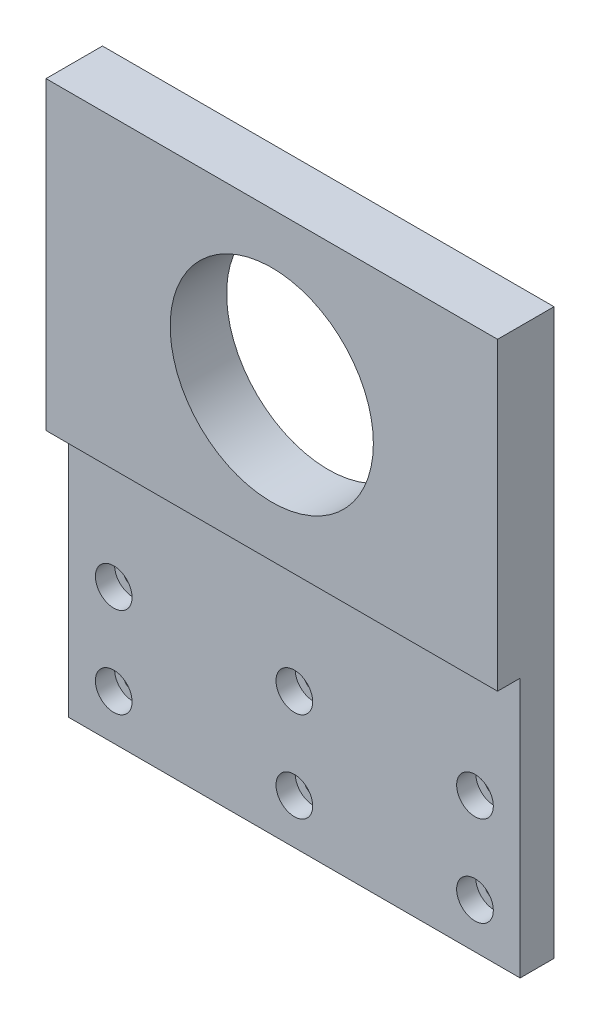
ISO-10303-21;
HEADER;
FILE_DESCRIPTION(('STEP AP214'),'2;1');
FILE_NAME('part.step','',(''),(''),'','','');
FILE_SCHEMA(('AUTOMOTIVE_DESIGN { 1 0 10303 214 1 1 1 1 }'));
ENDSEC;
DATA;
#1=APPLICATION_CONTEXT('core data for automotive mechanical design processes');
#2=APPLICATION_PROTOCOL_DEFINITION('international standard','automotive_design',2000,#1);
#3=PRODUCT_CONTEXT('',#1,'mechanical');
#4=PRODUCT('Part','Part','',(#3));
#5=PRODUCT_RELATED_PRODUCT_CATEGORY('part','',(#4));
#6=PRODUCT_DEFINITION_FORMATION('','',#4);
#7=PRODUCT_DEFINITION_CONTEXT('part definition',#1,'design');
#8=PRODUCT_DEFINITION('design','',#6,#7);
#9=PRODUCT_DEFINITION_SHAPE('','',#8);
#10=(LENGTH_UNIT() NAMED_UNIT(*) SI_UNIT(.MILLI.,.METRE.));
#11=(NAMED_UNIT(*) PLANE_ANGLE_UNIT() SI_UNIT($,.RADIAN.));
#12=(NAMED_UNIT(*) SI_UNIT($,.STERADIAN.) SOLID_ANGLE_UNIT());
#13=UNCERTAINTY_MEASURE_WITH_UNIT(LENGTH_MEASURE(1.E-05),#10,'distance_accuracy_value','');
#14=(GEOMETRIC_REPRESENTATION_CONTEXT(3) GLOBAL_UNCERTAINTY_ASSIGNED_CONTEXT((#13)) GLOBAL_UNIT_ASSIGNED_CONTEXT((#10,
#11,#12)) REPRESENTATION_CONTEXT('',''));
#15=CARTESIAN_POINT('',(0.,0.,0.));
#16=DIRECTION('',(0.,0.,1.));
#17=DIRECTION('',(1.,0.,0.));
#18=AXIS2_PLACEMENT_3D('',#15,#16,#17);
#19=CARTESIAN_POINT('',(0.,0.,10.));
#20=DIRECTION('',(1.,0.,0.));
#21=DIRECTION('',(0.,0.,-1.));
#22=AXIS2_PLACEMENT_3D('',#19,#20,#21);
#23=PLANE('',#22);
#24=DIRECTION('',(0.,-1.,0.));
#25=VECTOR('',#24,1.);
#26=CARTESIAN_POINT('',(0.,0.,6.));
#27=LINE('',#26,#25);
#28=CARTESIAN_POINT('',(0.,46.,6.));
#29=VERTEX_POINT('',#28);
#30=CARTESIAN_POINT('',(0.,0.,6.));
#31=VERTEX_POINT('',#30);
#32=EDGE_CURVE('E144',#29,#31,#27,.T.);
#33=ORIENTED_EDGE('',*,*,#32,.F.);
#34=DIRECTION('',(0.,0.,1.));
#35=VECTOR('',#34,1.);
#36=CARTESIAN_POINT('',(0.,46.,6.));
#37=LINE('',#36,#35);
#38=CARTESIAN_POINT('',(0.,46.,10.));
#39=VERTEX_POINT('',#38);
#40=EDGE_CURVE('E154',#29,#39,#37,.T.);
#41=ORIENTED_EDGE('',*,*,#40,.T.);
#42=DIRECTION('',(0.,-1.,0.));
#43=VECTOR('',#42,1.);
#44=CARTESIAN_POINT('',(0.,0.,10.));
#45=LINE('',#44,#43);
#46=CARTESIAN_POINT('',(0.,100.,10.));
#47=VERTEX_POINT('',#46);
#48=EDGE_CURVE('E98',#47,#39,#45,.T.);
#49=ORIENTED_EDGE('',*,*,#48,.F.);
#50=DIRECTION('',(0.,0.,-1.));
#51=VECTOR('',#50,1.);
#52=CARTESIAN_POINT('',(0.,100.,10.));
#53=LINE('',#52,#51);
#54=CARTESIAN_POINT('',(0.,100.,0.));
#55=VERTEX_POINT('',#54);
#56=EDGE_CURVE('E90',#47,#55,#53,.T.);
#57=ORIENTED_EDGE('',*,*,#56,.T.);
#58=DIRECTION('',(0.,-1.,0.));
#59=VECTOR('',#58,1.);
#60=CARTESIAN_POINT('',(0.,0.,0.));
#61=LINE('',#60,#59);
#62=CARTESIAN_POINT('',(0.,0.,0.));
#63=VERTEX_POINT('',#62);
#64=EDGE_CURVE('E105',#55,#63,#61,.T.);
#65=ORIENTED_EDGE('',*,*,#64,.T.);
#66=DIRECTION('',(0.,0.,-1.));
#67=VECTOR('',#66,1.);
#68=CARTESIAN_POINT('',(0.,0.,10.));
#69=LINE('',#68,#67);
#70=EDGE_CURVE('E11',#31,#63,#69,.T.);
#71=ORIENTED_EDGE('',*,*,#70,.F.);
#72=EDGE_LOOP('',(#33,#41,#49,#57,#65,#71));
#73=FACE_BOUND('',#72,.T.);
#74=ADVANCED_FACE('F45',(#73),#23,.F.);
#75=CARTESIAN_POINT('',(0.,0.,10.));
#76=DIRECTION('',(0.,1.,0.));
#77=DIRECTION('',(0.,0.,1.));
#78=AXIS2_PLACEMENT_3D('',#75,#76,#77);
#79=PLANE('',#78);
#80=DIRECTION('',(0.,0.,-1.));
#81=VECTOR('',#80,1.);
#82=CARTESIAN_POINT('',(80.,0.,10.));
#83=LINE('',#82,#81);
#84=CARTESIAN_POINT('',(80.,0.,6.));
#85=VERTEX_POINT('',#84);
#86=CARTESIAN_POINT('',(80.,0.,0.));
#87=VERTEX_POINT('',#86);
#88=EDGE_CURVE('E53',#85,#87,#83,.T.);
#89=ORIENTED_EDGE('',*,*,#88,.F.);
#90=DIRECTION('',(1.,0.,0.));
#91=VECTOR('',#90,1.);
#92=CARTESIAN_POINT('',(0.,0.,6.));
#93=LINE('',#92,#91);
#94=EDGE_CURVE('E142',#31,#85,#93,.T.);
#95=ORIENTED_EDGE('',*,*,#94,.F.);
#96=ORIENTED_EDGE('',*,*,#70,.T.);
#97=DIRECTION('',(1.,0.,0.));
#98=VECTOR('',#97,1.);
#99=CARTESIAN_POINT('',(0.,0.,0.));
#100=LINE('',#99,#98);
#101=EDGE_CURVE('E112',#63,#87,#100,.T.);
#102=ORIENTED_EDGE('',*,*,#101,.T.);
#103=EDGE_LOOP('',(#89,#95,#96,#102));
#104=FACE_BOUND('',#103,.T.);
#105=ADVANCED_FACE('F139',(#104),#79,.F.);
#106=CARTESIAN_POINT('',(80.,0.,10.));
#107=DIRECTION('',(-1.,0.,0.));
#108=DIRECTION('',(0.,0.,1.));
#109=AXIS2_PLACEMENT_3D('',#106,#107,#108);
#110=PLANE('',#109);
#111=DIRECTION('',(0.,1.,0.));
#112=VECTOR('',#111,1.);
#113=CARTESIAN_POINT('',(80.,0.,10.));
#114=LINE('',#113,#112);
#115=CARTESIAN_POINT('',(80.,46.,10.));
#116=VERTEX_POINT('',#115);
#117=CARTESIAN_POINT('',(80.,100.,10.));
#118=VERTEX_POINT('',#117);
#119=EDGE_CURVE('E176',#116,#118,#114,.T.);
#120=ORIENTED_EDGE('',*,*,#119,.F.);
#121=DIRECTION('',(0.,0.,1.));
#122=VECTOR('',#121,1.);
#123=CARTESIAN_POINT('',(80.,46.,6.));
#124=LINE('',#123,#122);
#125=CARTESIAN_POINT('',(80.,46.,6.));
#126=VERTEX_POINT('',#125);
#127=EDGE_CURVE('E60',#126,#116,#124,.T.);
#128=ORIENTED_EDGE('',*,*,#127,.F.);
#129=DIRECTION('',(0.,1.,0.));
#130=VECTOR('',#129,1.);
#131=CARTESIAN_POINT('',(80.,0.,6.));
#132=LINE('',#131,#130);
#133=EDGE_CURVE('E136',#85,#126,#132,.T.);
#134=ORIENTED_EDGE('',*,*,#133,.F.);
#135=ORIENTED_EDGE('',*,*,#88,.T.);
#136=DIRECTION('',(0.,1.,0.));
#137=VECTOR('',#136,1.);
#138=CARTESIAN_POINT('',(80.,0.,0.));
#139=LINE('',#138,#137);
#140=CARTESIAN_POINT('',(80.,100.,0.));
#141=VERTEX_POINT('',#140);
#142=EDGE_CURVE('E99',#87,#141,#139,.T.);
#143=ORIENTED_EDGE('',*,*,#142,.T.);
#144=DIRECTION('',(0.,0.,-1.));
#145=VECTOR('',#144,1.);
#146=CARTESIAN_POINT('',(80.,100.,10.));
#147=LINE('',#146,#145);
#148=EDGE_CURVE('E93',#118,#141,#147,.T.);
#149=ORIENTED_EDGE('',*,*,#148,.F.);
#150=EDGE_LOOP('',(#120,#128,#134,#135,#143,#149));
#151=FACE_BOUND('',#150,.T.);
#152=ADVANCED_FACE('F133',(#151),#110,.F.);
#153=CARTESIAN_POINT('',(0.,100.,10.));
#154=DIRECTION('',(0.,-1.,0.));
#155=DIRECTION('',(0.,0.,-1.));
#156=AXIS2_PLACEMENT_3D('',#153,#154,#155);
#157=PLANE('',#156);
#158=DIRECTION('',(-1.,0.,0.));
#159=VECTOR('',#158,1.);
#160=CARTESIAN_POINT('',(0.,100.,0.));
#161=LINE('',#160,#159);
#162=EDGE_CURVE('E87',#141,#55,#161,.T.);
#163=ORIENTED_EDGE('',*,*,#162,.T.);
#164=ORIENTED_EDGE('',*,*,#56,.F.);
#165=DIRECTION('',(-1.,0.,0.));
#166=VECTOR('',#165,1.);
#167=CARTESIAN_POINT('',(0.,100.,10.));
#168=LINE('',#167,#166);
#169=EDGE_CURVE('E69',#118,#47,#168,.T.);
#170=ORIENTED_EDGE('',*,*,#169,.F.);
#171=ORIENTED_EDGE('',*,*,#148,.T.);
#172=EDGE_LOOP('',(#163,#164,#170,#171));
#173=FACE_BOUND('',#172,.T.);
#174=ADVANCED_FACE('F89',(#173),#157,.F.);
#175=CARTESIAN_POINT('',(0.,0.,10.));
#176=DIRECTION('',(0.,0.,-1.));
#177=DIRECTION('',(-1.,0.,0.));
#178=AXIS2_PLACEMENT_3D('',#175,#176,#177);
#179=PLANE('',#178);
#180=CARTESIAN_POINT('',(40.,73.,10.));
#181=DIRECTION('',(0.,0.,1.));
#182=DIRECTION('',(1.,0.,0.));
#183=AXIS2_PLACEMENT_3D('',#180,#181,#182);
#184=CIRCLE('',#183,18.);
#185=CARTESIAN_POINT('',(58.,73.,10.));
#186=VERTEX_POINT('',#185);
#187=EDGE_CURVE('E120',#186,#186,#184,.T.);
#188=ORIENTED_EDGE('',*,*,#187,.F.);
#189=EDGE_LOOP('',(#188));
#190=FACE_BOUND('',#189,.T.);
#191=ORIENTED_EDGE('',*,*,#48,.T.);
#192=DIRECTION('',(-1.,0.,0.));
#193=VECTOR('',#192,1.);
#194=CARTESIAN_POINT('',(0.,46.,10.));
#195=LINE('',#194,#193);
#196=EDGE_CURVE('E157',#116,#39,#195,.T.);
#197=ORIENTED_EDGE('',*,*,#196,.F.);
#198=ORIENTED_EDGE('',*,*,#119,.T.);
#199=ORIENTED_EDGE('',*,*,#169,.T.);
#200=EDGE_LOOP('',(#191,#197,#198,#199));
#201=FACE_BOUND('',#200,.T.);
#202=ADVANCED_FACE('F179',(#190,#201),#179,.F.);
#203=CARTESIAN_POINT('',(0.,0.,0.));
#204=DIRECTION('',(0.,0.,-1.));
#205=DIRECTION('',(-1.,0.,0.));
#206=AXIS2_PLACEMENT_3D('',#203,#204,#205);
#207=PLANE('',#206);
#208=CARTESIAN_POINT('',(8.00000000000001,8.,0.));
#209=DIRECTION('',(0.,0.,1.));
#210=DIRECTION('',(1.,0.,0.));
#211=AXIS2_PLACEMENT_3D('',#208,#209,#210);
#212=CIRCLE('',#211,1.7);
#213=CARTESIAN_POINT('',(9.70000000000001,8.,0.));
#214=VERTEX_POINT('',#213);
#215=EDGE_CURVE('E447',#214,#214,#212,.T.);
#216=ORIENTED_EDGE('',*,*,#215,.T.);
#217=EDGE_LOOP('',(#216));
#218=FACE_BOUND('',#217,.T.);
#219=CARTESIAN_POINT('',(40.,8.,0.));
#220=DIRECTION('',(0.,0.,1.));
#221=DIRECTION('',(1.,0.,0.));
#222=AXIS2_PLACEMENT_3D('',#219,#220,#221);
#223=CIRCLE('',#222,1.7);
#224=CARTESIAN_POINT('',(41.7,8.,0.));
#225=VERTEX_POINT('',#224);
#226=EDGE_CURVE('E463',#225,#225,#223,.T.);
#227=ORIENTED_EDGE('',*,*,#226,.T.);
#228=EDGE_LOOP('',(#227));
#229=FACE_BOUND('',#228,.T.);
#230=CARTESIAN_POINT('',(72.,8.,0.));
#231=DIRECTION('',(0.,0.,1.));
#232=DIRECTION('',(1.,0.,0.));
#233=AXIS2_PLACEMENT_3D('',#230,#231,#232);
#234=CIRCLE('',#233,1.69999999999999);
#235=CARTESIAN_POINT('',(73.7,8.,0.));
#236=VERTEX_POINT('',#235);
#237=EDGE_CURVE('E479',#236,#236,#234,.T.);
#238=ORIENTED_EDGE('',*,*,#237,.T.);
#239=EDGE_LOOP('',(#238));
#240=FACE_BOUND('',#239,.T.);
#241=CARTESIAN_POINT('',(39.9999999999999,24.,0.));
#242=DIRECTION('',(0.,0.,1.));
#243=DIRECTION('',(1.,0.,0.));
#244=AXIS2_PLACEMENT_3D('',#241,#242,#243);
#245=CIRCLE('',#244,1.7);
#246=CARTESIAN_POINT('',(41.6999999999999,24.,0.));
#247=VERTEX_POINT('',#246);
#248=EDGE_CURVE('E495',#247,#247,#245,.T.);
#249=ORIENTED_EDGE('',*,*,#248,.T.);
#250=EDGE_LOOP('',(#249));
#251=FACE_BOUND('',#250,.T.);
#252=CARTESIAN_POINT('',(71.9999999999999,24.,0.));
#253=DIRECTION('',(0.,0.,1.));
#254=DIRECTION('',(1.,0.,0.));
#255=AXIS2_PLACEMENT_3D('',#252,#253,#254);
#256=CIRCLE('',#255,1.69999999999999);
#257=CARTESIAN_POINT('',(73.6999999999999,24.,0.));
#258=VERTEX_POINT('',#257);
#259=EDGE_CURVE('E511',#258,#258,#256,.T.);
#260=ORIENTED_EDGE('',*,*,#259,.T.);
#261=EDGE_LOOP('',(#260));
#262=FACE_BOUND('',#261,.T.);
#263=CARTESIAN_POINT('',(7.99999999999995,24.,0.));
#264=DIRECTION('',(0.,0.,1.));
#265=DIRECTION('',(1.,0.,0.));
#266=AXIS2_PLACEMENT_3D('',#263,#264,#265);
#267=CIRCLE('',#266,1.7);
#268=CARTESIAN_POINT('',(9.69999999999995,24.,0.));
#269=VERTEX_POINT('',#268);
#270=EDGE_CURVE('E170',#269,#269,#267,.T.);
#271=ORIENTED_EDGE('',*,*,#270,.T.);
#272=EDGE_LOOP('',(#271));
#273=FACE_BOUND('',#272,.T.);
#274=CARTESIAN_POINT('',(40.,73.,0.));
#275=DIRECTION('',(0.,0.,1.));
#276=DIRECTION('',(1.,0.,0.));
#277=AXIS2_PLACEMENT_3D('',#274,#275,#276);
#278=CIRCLE('',#277,18.);
#279=CARTESIAN_POINT('',(58.,73.,0.));
#280=VERTEX_POINT('',#279);
#281=EDGE_CURVE('E114',#280,#280,#278,.T.);
#282=ORIENTED_EDGE('',*,*,#281,.T.);
#283=EDGE_LOOP('',(#282));
#284=FACE_BOUND('',#283,.T.);
#285=ORIENTED_EDGE('',*,*,#64,.F.);
#286=ORIENTED_EDGE('',*,*,#162,.F.);
#287=ORIENTED_EDGE('',*,*,#142,.F.);
#288=ORIENTED_EDGE('',*,*,#101,.F.);
#289=EDGE_LOOP('',(#285,#286,#287,#288));
#290=FACE_BOUND('',#289,.T.);
#291=ADVANCED_FACE('F110',(#218,#229,#240,#251,#262,#273,#284,#290),#207,.T.);
#292=CARTESIAN_POINT('',(40.,73.,0.));
#293=DIRECTION('',(0.,0.,1.));
#294=DIRECTION('',(1.,0.,0.));
#295=AXIS2_PLACEMENT_3D('',#292,#293,#294);
#296=CYLINDRICAL_SURFACE('',#295,18.);
#297=ORIENTED_EDGE('',*,*,#281,.F.);
#298=EDGE_LOOP('',(#297));
#299=FACE_BOUND('',#298,.T.);
#300=ORIENTED_EDGE('',*,*,#187,.T.);
#301=EDGE_LOOP('',(#300));
#302=FACE_BOUND('',#301,.T.);
#303=ADVANCED_FACE('F188',(#299,#302),#296,.F.);
#304=CARTESIAN_POINT('',(0.,46.,6.));
#305=DIRECTION('',(0.,1.,0.));
#306=DIRECTION('',(-1.,0.,0.));
#307=AXIS2_PLACEMENT_3D('',#304,#305,#306);
#308=PLANE('',#307);
#309=ORIENTED_EDGE('',*,*,#196,.T.);
#310=ORIENTED_EDGE('',*,*,#40,.F.);
#311=DIRECTION('',(-1.,0.,0.));
#312=VECTOR('',#311,1.);
#313=CARTESIAN_POINT('',(0.,46.,6.));
#314=LINE('',#313,#312);
#315=EDGE_CURVE('E156',#126,#29,#314,.T.);
#316=ORIENTED_EDGE('',*,*,#315,.F.);
#317=ORIENTED_EDGE('',*,*,#127,.T.);
#318=EDGE_LOOP('',(#309,#310,#316,#317));
#319=FACE_BOUND('',#318,.T.);
#320=ADVANCED_FACE('F155',(#319),#308,.F.);
#321=CARTESIAN_POINT('',(0.,0.,6.));
#322=DIRECTION('',(0.,0.,-1.));
#323=DIRECTION('',(-1.,0.,0.));
#324=AXIS2_PLACEMENT_3D('',#321,#322,#323);
#325=PLANE('',#324);
#326=CARTESIAN_POINT('',(8.00000000000001,8.,6.));
#327=DIRECTION('',(0.,0.,1.));
#328=DIRECTION('',(1.,0.,0.));
#329=AXIS2_PLACEMENT_3D('',#326,#327,#328);
#330=CIRCLE('',#329,3.25);
#331=CARTESIAN_POINT('',(11.25,8.,6.));
#332=VERTEX_POINT('',#331);
#333=EDGE_CURVE('E437',#332,#332,#330,.T.);
#334=ORIENTED_EDGE('',*,*,#333,.F.);
#335=EDGE_LOOP('',(#334));
#336=FACE_BOUND('',#335,.T.);
#337=CARTESIAN_POINT('',(40.,8.,6.));
#338=DIRECTION('',(0.,0.,1.));
#339=DIRECTION('',(1.,0.,0.));
#340=AXIS2_PLACEMENT_3D('',#337,#338,#339);
#341=CIRCLE('',#340,3.25);
#342=CARTESIAN_POINT('',(43.25,8.,6.));
#343=VERTEX_POINT('',#342);
#344=EDGE_CURVE('E451',#343,#343,#341,.T.);
#345=ORIENTED_EDGE('',*,*,#344,.F.);
#346=EDGE_LOOP('',(#345));
#347=FACE_BOUND('',#346,.T.);
#348=CARTESIAN_POINT('',(72.,8.,6.));
#349=DIRECTION('',(0.,0.,1.));
#350=DIRECTION('',(1.,0.,0.));
#351=AXIS2_PLACEMENT_3D('',#348,#349,#350);
#352=CIRCLE('',#351,3.25);
#353=CARTESIAN_POINT('',(75.25,8.,6.));
#354=VERTEX_POINT('',#353);
#355=EDGE_CURVE('E467',#354,#354,#352,.T.);
#356=ORIENTED_EDGE('',*,*,#355,.F.);
#357=EDGE_LOOP('',(#356));
#358=FACE_BOUND('',#357,.T.);
#359=CARTESIAN_POINT('',(39.9999999999999,24.,6.));
#360=DIRECTION('',(0.,0.,1.));
#361=DIRECTION('',(1.,0.,0.));
#362=AXIS2_PLACEMENT_3D('',#359,#360,#361);
#363=CIRCLE('',#362,3.25);
#364=CARTESIAN_POINT('',(43.2499999999999,24.,6.));
#365=VERTEX_POINT('',#364);
#366=EDGE_CURVE('E483',#365,#365,#363,.T.);
#367=ORIENTED_EDGE('',*,*,#366,.F.);
#368=EDGE_LOOP('',(#367));
#369=FACE_BOUND('',#368,.T.);
#370=CARTESIAN_POINT('',(71.9999999999999,24.,6.));
#371=DIRECTION('',(0.,0.,1.));
#372=DIRECTION('',(1.,0.,0.));
#373=AXIS2_PLACEMENT_3D('',#370,#371,#372);
#374=CIRCLE('',#373,3.25);
#375=CARTESIAN_POINT('',(75.2499999999999,24.,6.));
#376=VERTEX_POINT('',#375);
#377=EDGE_CURVE('E499',#376,#376,#374,.T.);
#378=ORIENTED_EDGE('',*,*,#377,.F.);
#379=EDGE_LOOP('',(#378));
#380=FACE_BOUND('',#379,.T.);
#381=CARTESIAN_POINT('',(7.99999999999995,24.,6.));
#382=DIRECTION('',(0.,0.,1.));
#383=DIRECTION('',(1.,0.,0.));
#384=AXIS2_PLACEMENT_3D('',#381,#382,#383);
#385=CIRCLE('',#384,3.25);
#386=CARTESIAN_POINT('',(11.25,24.,6.));
#387=VERTEX_POINT('',#386);
#388=EDGE_CURVE('E515',#387,#387,#385,.T.);
#389=ORIENTED_EDGE('',*,*,#388,.F.);
#390=EDGE_LOOP('',(#389));
#391=FACE_BOUND('',#390,.T.);
#392=ORIENTED_EDGE('',*,*,#32,.T.);
#393=ORIENTED_EDGE('',*,*,#94,.T.);
#394=ORIENTED_EDGE('',*,*,#133,.T.);
#395=ORIENTED_EDGE('',*,*,#315,.T.);
#396=EDGE_LOOP('',(#392,#393,#394,#395));
#397=FACE_BOUND('',#396,.T.);
#398=ADVANCED_FACE('F160',(#336,#347,#358,#369,#380,#391,#397),#325,.F.);
#399=CARTESIAN_POINT('',(7.99999999999995,24.,6.));
#400=DIRECTION('',(0.,0.,1.));
#401=DIRECTION('',(1.,0.,0.));
#402=AXIS2_PLACEMENT_3D('',#399,#400,#401);
#403=CYLINDRICAL_SURFACE('',#402,1.7);
#404=ORIENTED_EDGE('',*,*,#270,.F.);
#405=EDGE_LOOP('',(#404));
#406=FACE_BOUND('',#405,.T.);
#407=CARTESIAN_POINT('',(7.99999999999995,24.,2.6));
#408=DIRECTION('',(0.,0.,1.));
#409=DIRECTION('',(1.,0.,0.));
#410=AXIS2_PLACEMENT_3D('',#407,#408,#409);
#411=CIRCLE('',#410,1.7);
#412=CARTESIAN_POINT('',(9.69999999999995,24.,2.6));
#413=VERTEX_POINT('',#412);
#414=EDGE_CURVE('E523',#413,#413,#411,.T.);
#415=ORIENTED_EDGE('',*,*,#414,.T.);
#416=EDGE_LOOP('',(#415));
#417=FACE_BOUND('',#416,.T.);
#418=ADVANCED_FACE('F248',(#406,#417),#403,.F.);
#419=CARTESIAN_POINT('',(9.69999999999995,24.,2.6));
#420=DIRECTION('',(0.,0.,-1.));
#421=DIRECTION('',(-1.,0.,0.));
#422=AXIS2_PLACEMENT_3D('',#419,#420,#421);
#423=PLANE('',#422);
#424=ORIENTED_EDGE('',*,*,#414,.F.);
#425=EDGE_LOOP('',(#424));
#426=FACE_BOUND('',#425,.T.);
#427=CARTESIAN_POINT('',(7.99999999999995,24.,2.6));
#428=DIRECTION('',(0.,0.,1.));
#429=DIRECTION('',(1.,0.,0.));
#430=AXIS2_PLACEMENT_3D('',#427,#428,#429);
#431=CIRCLE('',#430,3.25);
#432=CARTESIAN_POINT('',(11.25,24.,2.6));
#433=VERTEX_POINT('',#432);
#434=EDGE_CURVE('E519',#433,#433,#431,.T.);
#435=ORIENTED_EDGE('',*,*,#434,.T.);
#436=EDGE_LOOP('',(#435));
#437=FACE_BOUND('',#436,.T.);
#438=ADVANCED_FACE('F258',(#426,#437),#423,.F.);
#439=CARTESIAN_POINT('',(7.99999999999995,24.,6.));
#440=DIRECTION('',(0.,0.,1.));
#441=DIRECTION('',(1.,0.,0.));
#442=AXIS2_PLACEMENT_3D('',#439,#440,#441);
#443=CYLINDRICAL_SURFACE('',#442,3.25);
#444=ORIENTED_EDGE('',*,*,#434,.F.);
#445=EDGE_LOOP('',(#444));
#446=FACE_BOUND('',#445,.T.);
#447=ORIENTED_EDGE('',*,*,#388,.T.);
#448=EDGE_LOOP('',(#447));
#449=FACE_BOUND('',#448,.T.);
#450=ADVANCED_FACE('F268',(#446,#449),#443,.F.);
#451=CARTESIAN_POINT('',(71.9999999999999,24.,6.));
#452=DIRECTION('',(0.,0.,1.));
#453=DIRECTION('',(1.,0.,0.));
#454=AXIS2_PLACEMENT_3D('',#451,#452,#453);
#455=CYLINDRICAL_SURFACE('',#454,1.69999999999999);
#456=ORIENTED_EDGE('',*,*,#259,.F.);
#457=EDGE_LOOP('',(#456));
#458=FACE_BOUND('',#457,.T.);
#459=CARTESIAN_POINT('',(71.9999999999999,24.,2.6));
#460=DIRECTION('',(0.,0.,1.));
#461=DIRECTION('',(1.,0.,0.));
#462=AXIS2_PLACEMENT_3D('',#459,#460,#461);
#463=CIRCLE('',#462,1.69999999999999);
#464=CARTESIAN_POINT('',(73.6999999999999,24.,2.6));
#465=VERTEX_POINT('',#464);
#466=EDGE_CURVE('E507',#465,#465,#463,.T.);
#467=ORIENTED_EDGE('',*,*,#466,.T.);
#468=EDGE_LOOP('',(#467));
#469=FACE_BOUND('',#468,.T.);
#470=ADVANCED_FACE('F278',(#458,#469),#455,.F.);
#471=CARTESIAN_POINT('',(73.6999999999999,24.,2.6));
#472=DIRECTION('',(0.,0.,-1.));
#473=DIRECTION('',(-1.,0.,0.));
#474=AXIS2_PLACEMENT_3D('',#471,#472,#473);
#475=PLANE('',#474);
#476=ORIENTED_EDGE('',*,*,#466,.F.);
#477=EDGE_LOOP('',(#476));
#478=FACE_BOUND('',#477,.T.);
#479=CARTESIAN_POINT('',(71.9999999999999,24.,2.6));
#480=DIRECTION('',(0.,0.,1.));
#481=DIRECTION('',(1.,0.,0.));
#482=AXIS2_PLACEMENT_3D('',#479,#480,#481);
#483=CIRCLE('',#482,3.25);
#484=CARTESIAN_POINT('',(75.2499999999999,24.,2.6));
#485=VERTEX_POINT('',#484);
#486=EDGE_CURVE('E503',#485,#485,#483,.T.);
#487=ORIENTED_EDGE('',*,*,#486,.T.);
#488=EDGE_LOOP('',(#487));
#489=FACE_BOUND('',#488,.T.);
#490=ADVANCED_FACE('F288',(#478,#489),#475,.F.);
#491=CARTESIAN_POINT('',(71.9999999999999,24.,6.));
#492=DIRECTION('',(0.,0.,1.));
#493=DIRECTION('',(1.,0.,0.));
#494=AXIS2_PLACEMENT_3D('',#491,#492,#493);
#495=CYLINDRICAL_SURFACE('',#494,3.25);
#496=ORIENTED_EDGE('',*,*,#486,.F.);
#497=EDGE_LOOP('',(#496));
#498=FACE_BOUND('',#497,.T.);
#499=ORIENTED_EDGE('',*,*,#377,.T.);
#500=EDGE_LOOP('',(#499));
#501=FACE_BOUND('',#500,.T.);
#502=ADVANCED_FACE('F298',(#498,#501),#495,.F.);
#503=CARTESIAN_POINT('',(39.9999999999999,24.,6.));
#504=DIRECTION('',(0.,0.,1.));
#505=DIRECTION('',(1.,0.,0.));
#506=AXIS2_PLACEMENT_3D('',#503,#504,#505);
#507=CYLINDRICAL_SURFACE('',#506,1.7);
#508=ORIENTED_EDGE('',*,*,#248,.F.);
#509=EDGE_LOOP('',(#508));
#510=FACE_BOUND('',#509,.T.);
#511=CARTESIAN_POINT('',(39.9999999999999,24.,2.6));
#512=DIRECTION('',(0.,0.,1.));
#513=DIRECTION('',(1.,0.,0.));
#514=AXIS2_PLACEMENT_3D('',#511,#512,#513);
#515=CIRCLE('',#514,1.7);
#516=CARTESIAN_POINT('',(41.6999999999999,24.,2.6));
#517=VERTEX_POINT('',#516);
#518=EDGE_CURVE('E491',#517,#517,#515,.T.);
#519=ORIENTED_EDGE('',*,*,#518,.T.);
#520=EDGE_LOOP('',(#519));
#521=FACE_BOUND('',#520,.T.);
#522=ADVANCED_FACE('F308',(#510,#521),#507,.F.);
#523=CARTESIAN_POINT('',(41.6999999999999,24.,2.6));
#524=DIRECTION('',(0.,0.,-1.));
#525=DIRECTION('',(-1.,0.,0.));
#526=AXIS2_PLACEMENT_3D('',#523,#524,#525);
#527=PLANE('',#526);
#528=ORIENTED_EDGE('',*,*,#518,.F.);
#529=EDGE_LOOP('',(#528));
#530=FACE_BOUND('',#529,.T.);
#531=CARTESIAN_POINT('',(39.9999999999999,24.,2.6));
#532=DIRECTION('',(0.,0.,1.));
#533=DIRECTION('',(1.,0.,0.));
#534=AXIS2_PLACEMENT_3D('',#531,#532,#533);
#535=CIRCLE('',#534,3.25);
#536=CARTESIAN_POINT('',(43.2499999999999,24.,2.6));
#537=VERTEX_POINT('',#536);
#538=EDGE_CURVE('E487',#537,#537,#535,.T.);
#539=ORIENTED_EDGE('',*,*,#538,.T.);
#540=EDGE_LOOP('',(#539));
#541=FACE_BOUND('',#540,.T.);
#542=ADVANCED_FACE('F318',(#530,#541),#527,.F.);
#543=CARTESIAN_POINT('',(39.9999999999999,24.,6.));
#544=DIRECTION('',(0.,0.,1.));
#545=DIRECTION('',(1.,0.,0.));
#546=AXIS2_PLACEMENT_3D('',#543,#544,#545);
#547=CYLINDRICAL_SURFACE('',#546,3.25);
#548=ORIENTED_EDGE('',*,*,#538,.F.);
#549=EDGE_LOOP('',(#548));
#550=FACE_BOUND('',#549,.T.);
#551=ORIENTED_EDGE('',*,*,#366,.T.);
#552=EDGE_LOOP('',(#551));
#553=FACE_BOUND('',#552,.T.);
#554=ADVANCED_FACE('F328',(#550,#553),#547,.F.);
#555=CARTESIAN_POINT('',(72.,8.,6.));
#556=DIRECTION('',(0.,0.,1.));
#557=DIRECTION('',(1.,0.,0.));
#558=AXIS2_PLACEMENT_3D('',#555,#556,#557);
#559=CYLINDRICAL_SURFACE('',#558,1.69999999999999);
#560=ORIENTED_EDGE('',*,*,#237,.F.);
#561=EDGE_LOOP('',(#560));
#562=FACE_BOUND('',#561,.T.);
#563=CARTESIAN_POINT('',(72.,8.,2.6));
#564=DIRECTION('',(0.,0.,1.));
#565=DIRECTION('',(1.,0.,0.));
#566=AXIS2_PLACEMENT_3D('',#563,#564,#565);
#567=CIRCLE('',#566,1.69999999999999);
#568=CARTESIAN_POINT('',(73.7,8.,2.6));
#569=VERTEX_POINT('',#568);
#570=EDGE_CURVE('E475',#569,#569,#567,.T.);
#571=ORIENTED_EDGE('',*,*,#570,.T.);
#572=EDGE_LOOP('',(#571));
#573=FACE_BOUND('',#572,.T.);
#574=ADVANCED_FACE('F338',(#562,#573),#559,.F.);
#575=CARTESIAN_POINT('',(73.7,8.,2.6));
#576=DIRECTION('',(0.,0.,-1.));
#577=DIRECTION('',(-1.,0.,0.));
#578=AXIS2_PLACEMENT_3D('',#575,#576,#577);
#579=PLANE('',#578);
#580=ORIENTED_EDGE('',*,*,#570,.F.);
#581=EDGE_LOOP('',(#580));
#582=FACE_BOUND('',#581,.T.);
#583=CARTESIAN_POINT('',(72.,8.,2.6));
#584=DIRECTION('',(0.,0.,1.));
#585=DIRECTION('',(1.,0.,0.));
#586=AXIS2_PLACEMENT_3D('',#583,#584,#585);
#587=CIRCLE('',#586,3.25);
#588=CARTESIAN_POINT('',(75.25,8.,2.6));
#589=VERTEX_POINT('',#588);
#590=EDGE_CURVE('E471',#589,#589,#587,.T.);
#591=ORIENTED_EDGE('',*,*,#590,.T.);
#592=EDGE_LOOP('',(#591));
#593=FACE_BOUND('',#592,.T.);
#594=ADVANCED_FACE('F348',(#582,#593),#579,.F.);
#595=CARTESIAN_POINT('',(72.,8.,6.));
#596=DIRECTION('',(0.,0.,1.));
#597=DIRECTION('',(1.,0.,0.));
#598=AXIS2_PLACEMENT_3D('',#595,#596,#597);
#599=CYLINDRICAL_SURFACE('',#598,3.25);
#600=ORIENTED_EDGE('',*,*,#590,.F.);
#601=EDGE_LOOP('',(#600));
#602=FACE_BOUND('',#601,.T.);
#603=ORIENTED_EDGE('',*,*,#355,.T.);
#604=EDGE_LOOP('',(#603));
#605=FACE_BOUND('',#604,.T.);
#606=ADVANCED_FACE('F358',(#602,#605),#599,.F.);
#607=CARTESIAN_POINT('',(40.,8.,6.));
#608=DIRECTION('',(0.,0.,1.));
#609=DIRECTION('',(1.,0.,0.));
#610=AXIS2_PLACEMENT_3D('',#607,#608,#609);
#611=CYLINDRICAL_SURFACE('',#610,1.7);
#612=ORIENTED_EDGE('',*,*,#226,.F.);
#613=EDGE_LOOP('',(#612));
#614=FACE_BOUND('',#613,.T.);
#615=CARTESIAN_POINT('',(40.,8.,2.6));
#616=DIRECTION('',(0.,0.,1.));
#617=DIRECTION('',(1.,0.,0.));
#618=AXIS2_PLACEMENT_3D('',#615,#616,#617);
#619=CIRCLE('',#618,1.7);
#620=CARTESIAN_POINT('',(41.7,8.,2.6));
#621=VERTEX_POINT('',#620);
#622=EDGE_CURVE('E459',#621,#621,#619,.T.);
#623=ORIENTED_EDGE('',*,*,#622,.T.);
#624=EDGE_LOOP('',(#623));
#625=FACE_BOUND('',#624,.T.);
#626=ADVANCED_FACE('F368',(#614,#625),#611,.F.);
#627=CARTESIAN_POINT('',(41.7,8.,2.6));
#628=DIRECTION('',(0.,0.,-1.));
#629=DIRECTION('',(-1.,0.,0.));
#630=AXIS2_PLACEMENT_3D('',#627,#628,#629);
#631=PLANE('',#630);
#632=ORIENTED_EDGE('',*,*,#622,.F.);
#633=EDGE_LOOP('',(#632));
#634=FACE_BOUND('',#633,.T.);
#635=CARTESIAN_POINT('',(40.,8.,2.6));
#636=DIRECTION('',(0.,0.,1.));
#637=DIRECTION('',(1.,0.,0.));
#638=AXIS2_PLACEMENT_3D('',#635,#636,#637);
#639=CIRCLE('',#638,3.25);
#640=CARTESIAN_POINT('',(43.25,8.,2.6));
#641=VERTEX_POINT('',#640);
#642=EDGE_CURVE('E455',#641,#641,#639,.T.);
#643=ORIENTED_EDGE('',*,*,#642,.T.);
#644=EDGE_LOOP('',(#643));
#645=FACE_BOUND('',#644,.T.);
#646=ADVANCED_FACE('F378',(#634,#645),#631,.F.);
#647=CARTESIAN_POINT('',(40.,8.,6.));
#648=DIRECTION('',(0.,0.,1.));
#649=DIRECTION('',(1.,0.,0.));
#650=AXIS2_PLACEMENT_3D('',#647,#648,#649);
#651=CYLINDRICAL_SURFACE('',#650,3.25);
#652=ORIENTED_EDGE('',*,*,#642,.F.);
#653=EDGE_LOOP('',(#652));
#654=FACE_BOUND('',#653,.T.);
#655=ORIENTED_EDGE('',*,*,#344,.T.);
#656=EDGE_LOOP('',(#655));
#657=FACE_BOUND('',#656,.T.);
#658=ADVANCED_FACE('F388',(#654,#657),#651,.F.);
#659=CARTESIAN_POINT('',(8.00000000000001,8.,6.));
#660=DIRECTION('',(0.,0.,1.));
#661=DIRECTION('',(1.,0.,0.));
#662=AXIS2_PLACEMENT_3D('',#659,#660,#661);
#663=CYLINDRICAL_SURFACE('',#662,1.7);
#664=ORIENTED_EDGE('',*,*,#215,.F.);
#665=EDGE_LOOP('',(#664));
#666=FACE_BOUND('',#665,.T.);
#667=CARTESIAN_POINT('',(8.00000000000001,8.,2.6));
#668=DIRECTION('',(0.,0.,1.));
#669=DIRECTION('',(1.,0.,0.));
#670=AXIS2_PLACEMENT_3D('',#667,#668,#669);
#671=CIRCLE('',#670,1.7);
#672=CARTESIAN_POINT('',(9.70000000000001,8.,2.6));
#673=VERTEX_POINT('',#672);
#674=EDGE_CURVE('E441',#673,#673,#671,.T.);
#675=ORIENTED_EDGE('',*,*,#674,.T.);
#676=EDGE_LOOP('',(#675));
#677=FACE_BOUND('',#676,.T.);
#678=ADVANCED_FACE('F398',(#666,#677),#663,.F.);
#679=CARTESIAN_POINT('',(9.70000000000001,8.,2.6));
#680=DIRECTION('',(0.,0.,-1.));
#681=DIRECTION('',(-1.,0.,0.));
#682=AXIS2_PLACEMENT_3D('',#679,#680,#681);
#683=PLANE('',#682);
#684=ORIENTED_EDGE('',*,*,#674,.F.);
#685=EDGE_LOOP('',(#684));
#686=FACE_BOUND('',#685,.T.);
#687=CARTESIAN_POINT('',(8.00000000000001,8.,2.6));
#688=DIRECTION('',(0.,0.,1.));
#689=DIRECTION('',(1.,0.,0.));
#690=AXIS2_PLACEMENT_3D('',#687,#688,#689);
#691=CIRCLE('',#690,3.25);
#692=CARTESIAN_POINT('',(11.25,8.,2.6));
#693=VERTEX_POINT('',#692);
#694=EDGE_CURVE('E434',#693,#693,#691,.T.);
#695=ORIENTED_EDGE('',*,*,#694,.T.);
#696=EDGE_LOOP('',(#695));
#697=FACE_BOUND('',#696,.T.);
#698=ADVANCED_FACE('F408',(#686,#697),#683,.F.);
#699=CARTESIAN_POINT('',(8.00000000000001,8.,6.));
#700=DIRECTION('',(0.,0.,1.));
#701=DIRECTION('',(1.,0.,0.));
#702=AXIS2_PLACEMENT_3D('',#699,#700,#701);
#703=CYLINDRICAL_SURFACE('',#702,3.25);
#704=ORIENTED_EDGE('',*,*,#694,.F.);
#705=EDGE_LOOP('',(#704));
#706=FACE_BOUND('',#705,.T.);
#707=ORIENTED_EDGE('',*,*,#333,.T.);
#708=EDGE_LOOP('',(#707));
#709=FACE_BOUND('',#708,.T.);
#710=ADVANCED_FACE('F418',(#706,#709),#703,.F.);
#711=CLOSED_SHELL('',(#74,#105,#152,#174,#202,#291,#303,#320,#398,#418,#438,#450,#470,#490,#502,
#522,#542,#554,#574,#594,#606,#626,#646,#658,#678,#698,#710));
#712=MANIFOLD_SOLID_BREP('B2',#711);
#713=ADVANCED_BREP_SHAPE_REPRESENTATION('',(#18,#712),#14);
#714=SHAPE_DEFINITION_REPRESENTATION(#9,#713);
ENDSEC;
END-ISO-10303-21;
